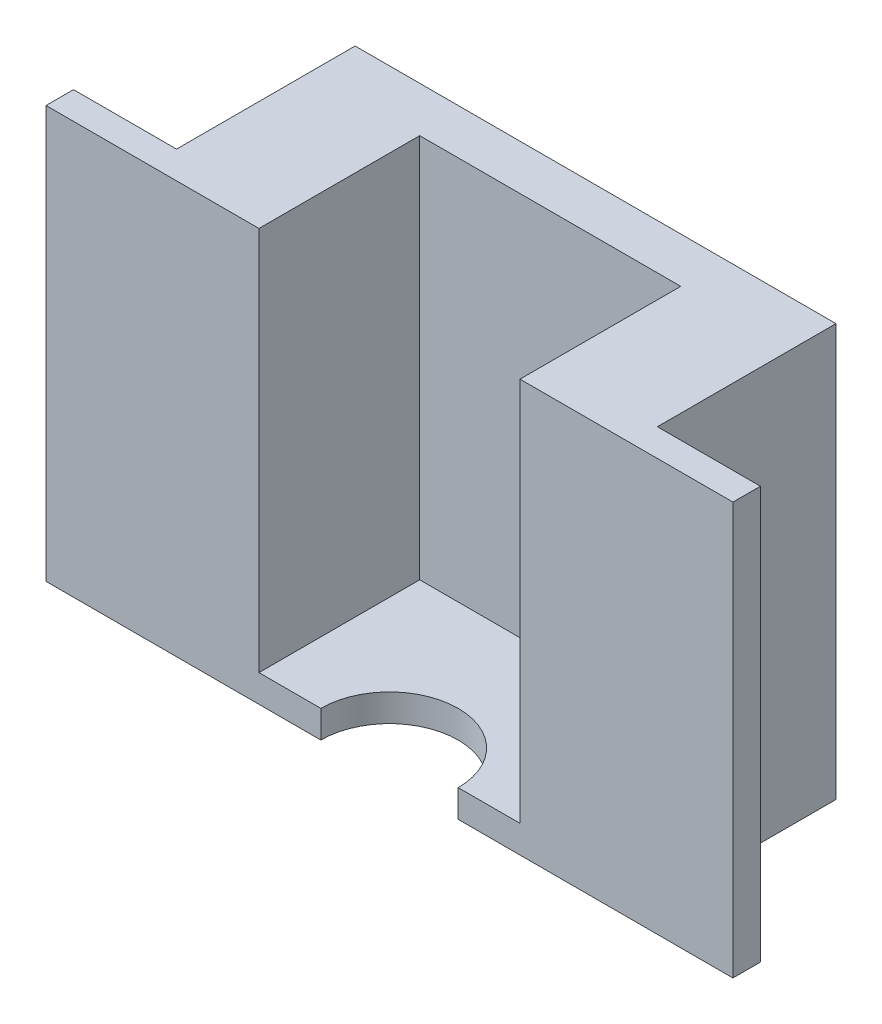
ISO-10303-21;
HEADER;
FILE_DESCRIPTION(('STEP AP214'),'2;1');
FILE_NAME('part.step','',(''),(''),'','','');
FILE_SCHEMA(('AUTOMOTIVE_DESIGN { 1 0 10303 214 1 1 1 1 }'));
ENDSEC;
DATA;
#1=APPLICATION_CONTEXT('core data for automotive mechanical design processes');
#2=APPLICATION_PROTOCOL_DEFINITION('international standard','automotive_design',2000,#1);
#3=PRODUCT_CONTEXT('',#1,'mechanical');
#4=PRODUCT('Part','Part','',(#3));
#5=PRODUCT_RELATED_PRODUCT_CATEGORY('part','',(#4));
#6=PRODUCT_DEFINITION_FORMATION('','',#4);
#7=PRODUCT_DEFINITION_CONTEXT('part definition',#1,'design');
#8=PRODUCT_DEFINITION('design','',#6,#7);
#9=PRODUCT_DEFINITION_SHAPE('','',#8);
#10=(LENGTH_UNIT() NAMED_UNIT(*) SI_UNIT(.MILLI.,.METRE.));
#11=(NAMED_UNIT(*) PLANE_ANGLE_UNIT() SI_UNIT($,.RADIAN.));
#12=(NAMED_UNIT(*) SI_UNIT($,.STERADIAN.) SOLID_ANGLE_UNIT());
#13=UNCERTAINTY_MEASURE_WITH_UNIT(LENGTH_MEASURE(1.E-05),#10,'distance_accuracy_value','');
#14=(GEOMETRIC_REPRESENTATION_CONTEXT(3) GLOBAL_UNCERTAINTY_ASSIGNED_CONTEXT((#13)) GLOBAL_UNIT_ASSIGNED_CONTEXT((#10,
#11,#12)) REPRESENTATION_CONTEXT('',''));
#15=CARTESIAN_POINT('',(0.,0.,0.));
#16=DIRECTION('',(0.,0.,1.));
#17=DIRECTION('',(1.,0.,0.));
#18=AXIS2_PLACEMENT_3D('',#15,#16,#17);
#19=CARTESIAN_POINT('',(0.,0.,15.));
#20=DIRECTION('',(0.,0.,1.));
#21=DIRECTION('',(1.,0.,0.));
#22=AXIS2_PLACEMENT_3D('',#19,#20,#21);
#23=PLANE('',#22);
#24=DIRECTION('',(0.,-1.,0.));
#25=VECTOR('',#24,1.);
#26=CARTESIAN_POINT('',(-4.99999999999999,35.,15.));
#27=LINE('',#26,#25);
#28=CARTESIAN_POINT('',(-4.99999999999999,-13.,15.));
#29=VERTEX_POINT('',#28);
#30=CARTESIAN_POINT('',(-4.99999999999999,-15.,15.));
#31=VERTEX_POINT('',#30);
#32=EDGE_CURVE('E137',#29,#31,#27,.T.);
#33=ORIENTED_EDGE('',*,*,#32,.F.);
#34=DIRECTION('',(1.,0.,0.));
#35=VECTOR('',#34,1.);
#36=CARTESIAN_POINT('',(-9.5,-13.,15.));
#37=LINE('',#36,#35);
#38=CARTESIAN_POINT('',(-9.5,-13.,15.));
#39=VERTEX_POINT('',#38);
#40=EDGE_CURVE('E233',#39,#29,#37,.T.);
#41=ORIENTED_EDGE('',*,*,#40,.F.);
#42=DIRECTION('',(0.,1.,0.));
#43=VECTOR('',#42,1.);
#44=CARTESIAN_POINT('',(-9.5,-13.,15.));
#45=LINE('',#44,#43);
#46=CARTESIAN_POINT('',(-9.5,15.,15.));
#47=VERTEX_POINT('',#46);
#48=EDGE_CURVE('E197',#39,#47,#45,.T.);
#49=ORIENTED_EDGE('',*,*,#48,.T.);
#50=DIRECTION('',(-1.,0.,0.));
#51=VECTOR('',#50,1.);
#52=CARTESIAN_POINT('',(-25.,15.,15.));
#53=LINE('',#52,#51);
#54=CARTESIAN_POINT('',(-25.,15.,15.));
#55=VERTEX_POINT('',#54);
#56=EDGE_CURVE('E194',#47,#55,#53,.T.);
#57=ORIENTED_EDGE('',*,*,#56,.T.);
#58=DIRECTION('',(0.,-1.,0.));
#59=VECTOR('',#58,1.);
#60=CARTESIAN_POINT('',(-25.,15.,15.));
#61=LINE('',#60,#59);
#62=CARTESIAN_POINT('',(-25.,-15.,15.));
#63=VERTEX_POINT('',#62);
#64=EDGE_CURVE('E158',#55,#63,#61,.T.);
#65=ORIENTED_EDGE('',*,*,#64,.T.);
#66=DIRECTION('',(1.,0.,0.));
#67=VECTOR('',#66,1.);
#68=CARTESIAN_POINT('',(-25.,-15.,15.));
#69=LINE('',#68,#67);
#70=EDGE_CURVE('E157',#63,#31,#69,.T.);
#71=ORIENTED_EDGE('',*,*,#70,.T.);
#72=EDGE_LOOP('',(#33,#41,#49,#57,#65,#71));
#73=FACE_BOUND('',#72,.T.);
#74=ADVANCED_FACE('F35',(#73),#23,.T.);
#75=CARTESIAN_POINT('',(25.,15.,15.));
#76=DIRECTION('',(-1.,0.,0.));
#77=DIRECTION('',(0.,-1.,0.));
#78=AXIS2_PLACEMENT_3D('',#75,#76,#77);
#79=PLANE('',#78);
#80=DIRECTION('',(0.,0.,-1.));
#81=VECTOR('',#80,1.);
#82=CARTESIAN_POINT('',(25.,-15.,15.));
#83=LINE('',#82,#81);
#84=CARTESIAN_POINT('',(25.,-15.,15.));
#85=VERTEX_POINT('',#84);
#86=CARTESIAN_POINT('',(25.,-15.,13.));
#87=VERTEX_POINT('',#86);
#88=EDGE_CURVE('E155',#85,#87,#83,.T.);
#89=ORIENTED_EDGE('',*,*,#88,.T.);
#90=DIRECTION('',(0.,1.,0.));
#91=VECTOR('',#90,1.);
#92=CARTESIAN_POINT('',(25.,-35.,13.));
#93=LINE('',#92,#91);
#94=CARTESIAN_POINT('',(25.,15.,13.));
#95=VERTEX_POINT('',#94);
#96=EDGE_CURVE('E192',#87,#95,#93,.T.);
#97=ORIENTED_EDGE('',*,*,#96,.T.);
#98=DIRECTION('',(0.,0.,-1.));
#99=VECTOR('',#98,1.);
#100=CARTESIAN_POINT('',(25.,15.,15.));
#101=LINE('',#100,#99);
#102=CARTESIAN_POINT('',(25.,15.,15.));
#103=VERTEX_POINT('',#102);
#104=EDGE_CURVE('E178',#103,#95,#101,.T.);
#105=ORIENTED_EDGE('',*,*,#104,.F.);
#106=DIRECTION('',(0.,1.,0.));
#107=VECTOR('',#106,1.);
#108=CARTESIAN_POINT('',(25.,15.,15.));
#109=LINE('',#108,#107);
#110=EDGE_CURVE('E170',#85,#103,#109,.T.);
#111=ORIENTED_EDGE('',*,*,#110,.F.);
#112=EDGE_LOOP('',(#89,#97,#105,#111));
#113=FACE_BOUND('',#112,.T.);
#114=ADVANCED_FACE('F37',(#113),#79,.F.);
#115=CARTESIAN_POINT('',(-25.,15.,15.));
#116=DIRECTION('',(0.,-1.,0.));
#117=DIRECTION('',(0.,0.,-1.));
#118=AXIS2_PLACEMENT_3D('',#115,#116,#117);
#119=PLANE('',#118);
#120=ORIENTED_EDGE('',*,*,#104,.T.);
#121=DIRECTION('',(1.,0.,0.));
#122=VECTOR('',#121,1.);
#123=CARTESIAN_POINT('',(25.,15.,13.));
#124=LINE('',#123,#122);
#125=CARTESIAN_POINT('',(17.5,15.,13.));
#126=VERTEX_POINT('',#125);
#127=EDGE_CURVE('E254',#126,#95,#124,.T.);
#128=ORIENTED_EDGE('',*,*,#127,.F.);
#129=DIRECTION('',(0.,0.,1.));
#130=VECTOR('',#129,1.);
#131=CARTESIAN_POINT('',(17.5,15.,0.));
#132=LINE('',#131,#130);
#133=CARTESIAN_POINT('',(17.5,15.,0.));
#134=VERTEX_POINT('',#133);
#135=EDGE_CURVE('E257',#134,#126,#132,.T.);
#136=ORIENTED_EDGE('',*,*,#135,.F.);
#137=DIRECTION('',(-1.,0.,0.));
#138=VECTOR('',#137,1.);
#139=CARTESIAN_POINT('',(-25.,15.,0.));
#140=LINE('',#139,#138);
#141=CARTESIAN_POINT('',(-17.5,15.,0.));
#142=VERTEX_POINT('',#141);
#143=EDGE_CURVE('E164',#134,#142,#140,.T.);
#144=ORIENTED_EDGE('',*,*,#143,.T.);
#145=DIRECTION('',(0.,0.,-1.));
#146=VECTOR('',#145,1.);
#147=CARTESIAN_POINT('',(-17.5,15.,0.));
#148=LINE('',#147,#146);
#149=CARTESIAN_POINT('',(-17.5,15.,13.));
#150=VERTEX_POINT('',#149);
#151=EDGE_CURVE('E244',#150,#142,#148,.T.);
#152=ORIENTED_EDGE('',*,*,#151,.F.);
#153=DIRECTION('',(1.,0.,0.));
#154=VECTOR('',#153,1.);
#155=CARTESIAN_POINT('',(-25.,15.,13.));
#156=LINE('',#155,#154);
#157=CARTESIAN_POINT('',(-25.,15.,13.));
#158=VERTEX_POINT('',#157);
#159=EDGE_CURVE('E248',#158,#150,#156,.T.);
#160=ORIENTED_EDGE('',*,*,#159,.F.);
#161=DIRECTION('',(0.,0.,-1.));
#162=VECTOR('',#161,1.);
#163=CARTESIAN_POINT('',(-25.,15.,15.));
#164=LINE('',#163,#162);
#165=EDGE_CURVE('E175',#55,#158,#164,.T.);
#166=ORIENTED_EDGE('',*,*,#165,.F.);
#167=ORIENTED_EDGE('',*,*,#56,.F.);
#168=DIRECTION('',(0.,0.,1.));
#169=VECTOR('',#168,1.);
#170=CARTESIAN_POINT('',(-9.5,15.,15.));
#171=LINE('',#170,#169);
#172=CARTESIAN_POINT('',(-9.5,15.,3.3));
#173=VERTEX_POINT('',#172);
#174=EDGE_CURVE('E211',#173,#47,#171,.T.);
#175=ORIENTED_EDGE('',*,*,#174,.F.);
#176=DIRECTION('',(-1.,0.,0.));
#177=VECTOR('',#176,1.);
#178=CARTESIAN_POINT('',(-9.5,15.,3.3));
#179=LINE('',#178,#177);
#180=CARTESIAN_POINT('',(9.5,15.,3.3));
#181=VERTEX_POINT('',#180);
#182=EDGE_CURVE('E209',#181,#173,#179,.T.);
#183=ORIENTED_EDGE('',*,*,#182,.F.);
#184=DIRECTION('',(0.,0.,-1.));
#185=VECTOR('',#184,1.);
#186=CARTESIAN_POINT('',(9.5,15.,15.));
#187=LINE('',#186,#185);
#188=CARTESIAN_POINT('',(9.5,15.,15.));
#189=VERTEX_POINT('',#188);
#190=EDGE_CURVE('E206',#189,#181,#187,.T.);
#191=ORIENTED_EDGE('',*,*,#190,.F.);
#192=EDGE_CURVE('E160',#103,#189,#53,.T.);
#193=ORIENTED_EDGE('',*,*,#192,.F.);
#194=EDGE_LOOP('',(#120,#128,#136,#144,#152,#160,#166,#167,#175,#183,#191,#193));
#195=FACE_BOUND('',#194,.T.);
#196=ADVANCED_FACE('F202',(#195),#119,.F.);
#197=CARTESIAN_POINT('',(-25.,15.,15.));
#198=DIRECTION('',(1.,0.,0.));
#199=DIRECTION('',(0.,1.,0.));
#200=AXIS2_PLACEMENT_3D('',#197,#198,#199);
#201=PLANE('',#200);
#202=ORIENTED_EDGE('',*,*,#165,.T.);
#203=DIRECTION('',(0.,1.,0.));
#204=VECTOR('',#203,1.);
#205=CARTESIAN_POINT('',(-25.,-35.,13.));
#206=LINE('',#205,#204);
#207=CARTESIAN_POINT('',(-25.,-15.,13.));
#208=VERTEX_POINT('',#207);
#209=EDGE_CURVE('E242',#208,#158,#206,.T.);
#210=ORIENTED_EDGE('',*,*,#209,.F.);
#211=DIRECTION('',(0.,0.,-1.));
#212=VECTOR('',#211,1.);
#213=CARTESIAN_POINT('',(-25.,-15.,15.));
#214=LINE('',#213,#212);
#215=EDGE_CURVE('E172',#63,#208,#214,.T.);
#216=ORIENTED_EDGE('',*,*,#215,.F.);
#217=ORIENTED_EDGE('',*,*,#64,.F.);
#218=EDGE_LOOP('',(#202,#210,#216,#217));
#219=FACE_BOUND('',#218,.T.);
#220=ADVANCED_FACE('F291',(#219),#201,.F.);
#221=CARTESIAN_POINT('',(-25.,-15.,15.));
#222=DIRECTION('',(0.,1.,0.));
#223=DIRECTION('',(0.,0.,1.));
#224=AXIS2_PLACEMENT_3D('',#221,#222,#223);
#225=PLANE('',#224);
#226=CARTESIAN_POINT('',(5.00000000000001,-15.,15.));
#227=VERTEX_POINT('',#226);
#228=EDGE_CURVE('E147',#227,#85,#69,.T.);
#229=ORIENTED_EDGE('',*,*,#228,.F.);
#230=CARTESIAN_POINT('',(0.,-15.,15.));
#231=DIRECTION('',(0.,-1.,0.));
#232=DIRECTION('',(0.,0.,-1.));
#233=AXIS2_PLACEMENT_3D('',#230,#231,#232);
#234=CIRCLE('',#233,5.);
#235=EDGE_CURVE('E134',#31,#227,#234,.T.);
#236=ORIENTED_EDGE('',*,*,#235,.F.);
#237=ORIENTED_EDGE('',*,*,#70,.F.);
#238=ORIENTED_EDGE('',*,*,#215,.T.);
#239=DIRECTION('',(1.,0.,0.));
#240=VECTOR('',#239,1.);
#241=CARTESIAN_POINT('',(-25.,-15.,13.));
#242=LINE('',#241,#240);
#243=CARTESIAN_POINT('',(-17.5,-15.,13.));
#244=VERTEX_POINT('',#243);
#245=EDGE_CURVE('E184',#208,#244,#242,.T.);
#246=ORIENTED_EDGE('',*,*,#245,.T.);
#247=DIRECTION('',(0.,0.,-1.));
#248=VECTOR('',#247,1.);
#249=CARTESIAN_POINT('',(-17.5,-15.,15.));
#250=LINE('',#249,#248);
#251=CARTESIAN_POINT('',(-17.5,-15.,0.));
#252=VERTEX_POINT('',#251);
#253=EDGE_CURVE('E215',#244,#252,#250,.T.);
#254=ORIENTED_EDGE('',*,*,#253,.T.);
#255=DIRECTION('',(1.,0.,0.));
#256=VECTOR('',#255,1.);
#257=CARTESIAN_POINT('',(-25.,-15.,0.));
#258=LINE('',#257,#256);
#259=CARTESIAN_POINT('',(17.5,-15.,0.));
#260=VERTEX_POINT('',#259);
#261=EDGE_CURVE('E166',#252,#260,#258,.T.);
#262=ORIENTED_EDGE('',*,*,#261,.T.);
#263=DIRECTION('',(0.,0.,1.));
#264=VECTOR('',#263,1.);
#265=CARTESIAN_POINT('',(17.5,-15.,15.));
#266=LINE('',#265,#264);
#267=CARTESIAN_POINT('',(17.5,-15.,13.));
#268=VERTEX_POINT('',#267);
#269=EDGE_CURVE('E57',#260,#268,#266,.T.);
#270=ORIENTED_EDGE('',*,*,#269,.T.);
#271=DIRECTION('',(1.,0.,0.));
#272=VECTOR('',#271,1.);
#273=CARTESIAN_POINT('',(-25.,-15.,13.));
#274=LINE('',#273,#272);
#275=EDGE_CURVE('E43',#268,#87,#274,.T.);
#276=ORIENTED_EDGE('',*,*,#275,.T.);
#277=ORIENTED_EDGE('',*,*,#88,.F.);
#278=EDGE_LOOP('',(#229,#236,#237,#238,#246,#254,#262,#270,#276,#277));
#279=FACE_BOUND('',#278,.T.);
#280=ADVANCED_FACE('F152',(#279),#225,.F.);
#281=DIRECTION('',(0.,-1.,0.));
#282=VECTOR('',#281,1.);
#283=CARTESIAN_POINT('',(5.00000000000001,35.,15.));
#284=LINE('',#283,#282);
#285=CARTESIAN_POINT('',(5.00000000000001,-13.,15.));
#286=VERTEX_POINT('',#285);
#287=EDGE_CURVE('E50',#286,#227,#284,.T.);
#288=ORIENTED_EDGE('',*,*,#287,.T.);
#289=ORIENTED_EDGE('',*,*,#228,.T.);
#290=ORIENTED_EDGE('',*,*,#110,.T.);
#291=ORIENTED_EDGE('',*,*,#192,.T.);
#292=DIRECTION('',(0.,1.,0.));
#293=VECTOR('',#292,1.);
#294=CARTESIAN_POINT('',(9.5,-13.,15.));
#295=LINE('',#294,#293);
#296=CARTESIAN_POINT('',(9.5,-13.,15.));
#297=VERTEX_POINT('',#296);
#298=EDGE_CURVE('E199',#297,#189,#295,.T.);
#299=ORIENTED_EDGE('',*,*,#298,.F.);
#300=EDGE_CURVE('E150',#286,#297,#37,.T.);
#301=ORIENTED_EDGE('',*,*,#300,.F.);
#302=EDGE_LOOP('',(#288,#289,#290,#291,#299,#301));
#303=FACE_BOUND('',#302,.T.);
#304=ADVANCED_FACE('F145',(#303),#23,.T.);
#305=CARTESIAN_POINT('',(0.,0.,0.));
#306=DIRECTION('',(0.,0.,1.));
#307=DIRECTION('',(1.,0.,0.));
#308=AXIS2_PLACEMENT_3D('',#305,#306,#307);
#309=PLANE('',#308);
#310=ORIENTED_EDGE('',*,*,#143,.F.);
#311=DIRECTION('',(0.,-1.,0.));
#312=VECTOR('',#311,1.);
#313=CARTESIAN_POINT('',(17.5,0.,0.));
#314=LINE('',#313,#312);
#315=EDGE_CURVE('E187',#134,#260,#314,.T.);
#316=ORIENTED_EDGE('',*,*,#315,.T.);
#317=ORIENTED_EDGE('',*,*,#261,.F.);
#318=DIRECTION('',(0.,1.,0.));
#319=VECTOR('',#318,1.);
#320=CARTESIAN_POINT('',(-17.5,0.,0.));
#321=LINE('',#320,#319);
#322=EDGE_CURVE('E181',#252,#142,#321,.T.);
#323=ORIENTED_EDGE('',*,*,#322,.T.);
#324=EDGE_LOOP('',(#310,#316,#317,#323));
#325=FACE_BOUND('',#324,.T.);
#326=ADVANCED_FACE('F284',(#325),#309,.F.);
#327=CARTESIAN_POINT('',(-9.5,-13.,15.));
#328=DIRECTION('',(-1.,0.,0.));
#329=DIRECTION('',(0.,0.,1.));
#330=AXIS2_PLACEMENT_3D('',#327,#328,#329);
#331=PLANE('',#330);
#332=ORIENTED_EDGE('',*,*,#174,.T.);
#333=ORIENTED_EDGE('',*,*,#48,.F.);
#334=DIRECTION('',(0.,0.,1.));
#335=VECTOR('',#334,1.);
#336=CARTESIAN_POINT('',(-9.5,-13.,15.));
#337=LINE('',#336,#335);
#338=CARTESIAN_POINT('',(-9.5,-13.,3.3));
#339=VERTEX_POINT('',#338);
#340=EDGE_CURVE('E213',#339,#39,#337,.T.);
#341=ORIENTED_EDGE('',*,*,#340,.F.);
#342=DIRECTION('',(0.,1.,0.));
#343=VECTOR('',#342,1.);
#344=CARTESIAN_POINT('',(-9.5,-13.,3.3));
#345=LINE('',#344,#343);
#346=EDGE_CURVE('E167',#339,#173,#345,.T.);
#347=ORIENTED_EDGE('',*,*,#346,.T.);
#348=EDGE_LOOP('',(#332,#333,#341,#347));
#349=FACE_BOUND('',#348,.T.);
#350=ADVANCED_FACE('F289',(#349),#331,.F.);
#351=CARTESIAN_POINT('',(-9.5,-13.,3.3));
#352=DIRECTION('',(0.,0.,-1.));
#353=DIRECTION('',(-1.,0.,0.));
#354=AXIS2_PLACEMENT_3D('',#351,#352,#353);
#355=PLANE('',#354);
#356=ORIENTED_EDGE('',*,*,#182,.T.);
#357=ORIENTED_EDGE('',*,*,#346,.F.);
#358=DIRECTION('',(-1.,0.,0.));
#359=VECTOR('',#358,1.);
#360=CARTESIAN_POINT('',(-9.5,-13.,3.3));
#361=LINE('',#360,#359);
#362=CARTESIAN_POINT('',(9.5,-13.,3.3));
#363=VERTEX_POINT('',#362);
#364=EDGE_CURVE('E223',#363,#339,#361,.T.);
#365=ORIENTED_EDGE('',*,*,#364,.F.);
#366=DIRECTION('',(0.,1.,0.));
#367=VECTOR('',#366,1.);
#368=CARTESIAN_POINT('',(9.5,-13.,3.3));
#369=LINE('',#368,#367);
#370=EDGE_CURVE('E220',#363,#181,#369,.T.);
#371=ORIENTED_EDGE('',*,*,#370,.T.);
#372=EDGE_LOOP('',(#356,#357,#365,#371));
#373=FACE_BOUND('',#372,.T.);
#374=ADVANCED_FACE('F386',(#373),#355,.F.);
#375=CARTESIAN_POINT('',(9.5,-13.,15.));
#376=DIRECTION('',(1.,0.,0.));
#377=DIRECTION('',(0.,0.,-1.));
#378=AXIS2_PLACEMENT_3D('',#375,#376,#377);
#379=PLANE('',#378);
#380=ORIENTED_EDGE('',*,*,#190,.T.);
#381=ORIENTED_EDGE('',*,*,#370,.F.);
#382=DIRECTION('',(0.,0.,-1.));
#383=VECTOR('',#382,1.);
#384=CARTESIAN_POINT('',(9.5,-13.,15.));
#385=LINE('',#384,#383);
#386=EDGE_CURVE('E229',#297,#363,#385,.T.);
#387=ORIENTED_EDGE('',*,*,#386,.F.);
#388=ORIENTED_EDGE('',*,*,#298,.T.);
#389=EDGE_LOOP('',(#380,#381,#387,#388));
#390=FACE_BOUND('',#389,.T.);
#391=ADVANCED_FACE('F315',(#390),#379,.F.);
#392=CARTESIAN_POINT('',(0.,-13.,0.));
#393=DIRECTION('',(0.,-1.,0.));
#394=DIRECTION('',(0.,0.,-1.));
#395=AXIS2_PLACEMENT_3D('',#392,#393,#394);
#396=PLANE('',#395);
#397=ORIENTED_EDGE('',*,*,#40,.T.);
#398=CARTESIAN_POINT('',(0.,-13.,15.));
#399=DIRECTION('',(0.,-1.,0.));
#400=DIRECTION('',(0.,0.,-1.));
#401=AXIS2_PLACEMENT_3D('',#398,#399,#400);
#402=CIRCLE('',#401,5.);
#403=EDGE_CURVE('E11',#29,#286,#402,.T.);
#404=ORIENTED_EDGE('',*,*,#403,.T.);
#405=ORIENTED_EDGE('',*,*,#300,.T.);
#406=ORIENTED_EDGE('',*,*,#386,.T.);
#407=ORIENTED_EDGE('',*,*,#364,.T.);
#408=ORIENTED_EDGE('',*,*,#340,.T.);
#409=EDGE_LOOP('',(#397,#404,#405,#406,#407,#408));
#410=FACE_BOUND('',#409,.T.);
#411=ADVANCED_FACE('F324',(#410),#396,.F.);
#412=CARTESIAN_POINT('',(-25.,-35.,13.));
#413=DIRECTION('',(0.,0.,1.));
#414=DIRECTION('',(1.,0.,0.));
#415=AXIS2_PLACEMENT_3D('',#412,#413,#414);
#416=PLANE('',#415);
#417=ORIENTED_EDGE('',*,*,#209,.T.);
#418=ORIENTED_EDGE('',*,*,#159,.T.);
#419=DIRECTION('',(0.,1.,0.));
#420=VECTOR('',#419,1.);
#421=CARTESIAN_POINT('',(-17.5,-35.,13.));
#422=LINE('',#421,#420);
#423=EDGE_CURVE('E241',#244,#150,#422,.T.);
#424=ORIENTED_EDGE('',*,*,#423,.F.);
#425=ORIENTED_EDGE('',*,*,#245,.F.);
#426=EDGE_LOOP('',(#417,#418,#424,#425));
#427=FACE_BOUND('',#426,.T.);
#428=ADVANCED_FACE('F272',(#427),#416,.F.);
#429=CARTESIAN_POINT('',(-17.5,-35.,0.));
#430=DIRECTION('',(1.,0.,0.));
#431=DIRECTION('',(0.,0.,-1.));
#432=AXIS2_PLACEMENT_3D('',#429,#430,#431);
#433=PLANE('',#432);
#434=ORIENTED_EDGE('',*,*,#423,.T.);
#435=ORIENTED_EDGE('',*,*,#151,.T.);
#436=ORIENTED_EDGE('',*,*,#322,.F.);
#437=ORIENTED_EDGE('',*,*,#253,.F.);
#438=EDGE_LOOP('',(#434,#435,#436,#437));
#439=FACE_BOUND('',#438,.T.);
#440=ADVANCED_FACE('F265',(#439),#433,.F.);
#441=CARTESIAN_POINT('',(25.,-35.,13.));
#442=DIRECTION('',(0.,0.,1.));
#443=DIRECTION('',(1.,0.,0.));
#444=AXIS2_PLACEMENT_3D('',#441,#442,#443);
#445=PLANE('',#444);
#446=DIRECTION('',(0.,1.,0.));
#447=VECTOR('',#446,1.);
#448=CARTESIAN_POINT('',(17.5,-35.,13.));
#449=LINE('',#448,#447);
#450=EDGE_CURVE('E252',#268,#126,#449,.T.);
#451=ORIENTED_EDGE('',*,*,#450,.T.);
#452=ORIENTED_EDGE('',*,*,#127,.T.);
#453=ORIENTED_EDGE('',*,*,#96,.F.);
#454=ORIENTED_EDGE('',*,*,#275,.F.);
#455=EDGE_LOOP('',(#451,#452,#453,#454));
#456=FACE_BOUND('',#455,.T.);
#457=ADVANCED_FACE('F263',(#456),#445,.F.);
#458=CARTESIAN_POINT('',(17.5,-35.,0.));
#459=DIRECTION('',(-1.,0.,0.));
#460=DIRECTION('',(0.,0.,1.));
#461=AXIS2_PLACEMENT_3D('',#458,#459,#460);
#462=PLANE('',#461);
#463=ORIENTED_EDGE('',*,*,#315,.F.);
#464=ORIENTED_EDGE('',*,*,#135,.T.);
#465=ORIENTED_EDGE('',*,*,#450,.F.);
#466=ORIENTED_EDGE('',*,*,#269,.F.);
#467=EDGE_LOOP('',(#463,#464,#465,#466));
#468=FACE_BOUND('',#467,.T.);
#469=ADVANCED_FACE('F261',(#468),#462,.F.);
#470=CARTESIAN_POINT('',(0.,35.,15.));
#471=DIRECTION('',(0.,-1.,0.));
#472=DIRECTION('',(0.,0.,-1.));
#473=AXIS2_PLACEMENT_3D('',#470,#471,#472);
#474=CYLINDRICAL_SURFACE('',#473,5.);
#475=ORIENTED_EDGE('',*,*,#32,.T.);
#476=ORIENTED_EDGE('',*,*,#235,.T.);
#477=ORIENTED_EDGE('',*,*,#287,.F.);
#478=ORIENTED_EDGE('',*,*,#403,.F.);
#479=EDGE_LOOP('',(#475,#476,#477,#478));
#480=FACE_BOUND('',#479,.T.);
#481=ADVANCED_FACE('F135',(#480),#474,.F.);
#482=CLOSED_SHELL('',(#74,#114,#196,#220,#280,#304,#326,#350,#374,#391,#411,#428,#440,#457,#469,#481));
#483=MANIFOLD_SOLID_BREP('B2',#482);
#484=ADVANCED_BREP_SHAPE_REPRESENTATION('',(#18,#483),#14);
#485=SHAPE_DEFINITION_REPRESENTATION(#9,#484);
ENDSEC;
END-ISO-10303-21;
